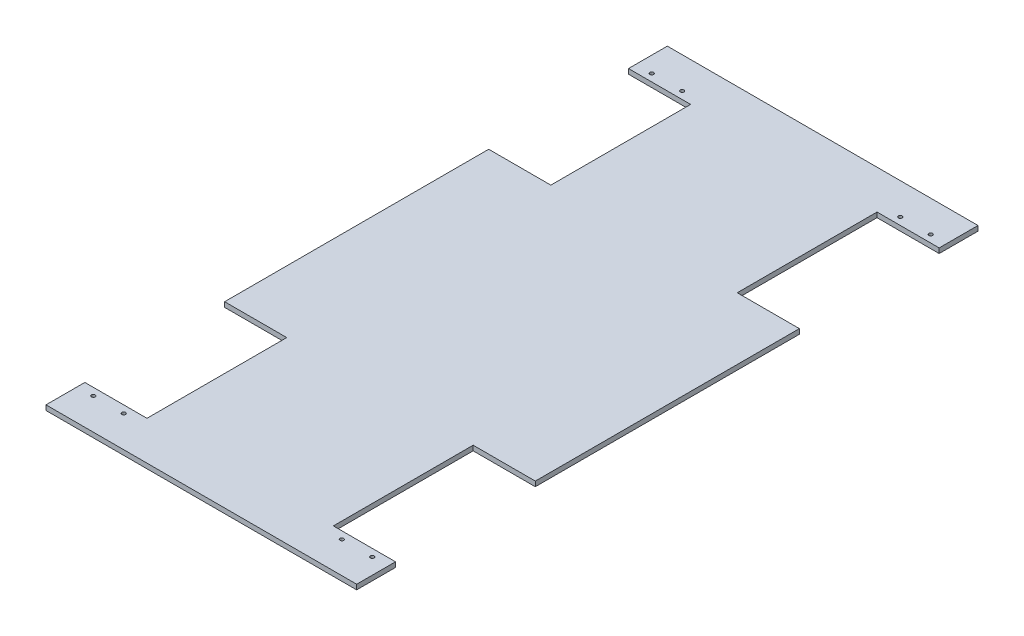
ISO-10303-21;
HEADER;
FILE_DESCRIPTION(('STEP AP214'),'2;1');
FILE_NAME('part.step','',(''),(''),'','','');
FILE_SCHEMA(('AUTOMOTIVE_DESIGN { 1 0 10303 214 1 1 1 1 }'));
ENDSEC;
DATA;
#1=APPLICATION_CONTEXT('core data for automotive mechanical design processes');
#2=APPLICATION_PROTOCOL_DEFINITION('international standard','automotive_design',2000,#1);
#3=PRODUCT_CONTEXT('',#1,'mechanical');
#4=PRODUCT('Part','Part','',(#3));
#5=PRODUCT_RELATED_PRODUCT_CATEGORY('part','',(#4));
#6=PRODUCT_DEFINITION_FORMATION('','',#4);
#7=PRODUCT_DEFINITION_CONTEXT('part definition',#1,'design');
#8=PRODUCT_DEFINITION('design','',#6,#7);
#9=PRODUCT_DEFINITION_SHAPE('','',#8);
#10=(LENGTH_UNIT() NAMED_UNIT(*) SI_UNIT(.MILLI.,.METRE.));
#11=(NAMED_UNIT(*) PLANE_ANGLE_UNIT() SI_UNIT($,.RADIAN.));
#12=(NAMED_UNIT(*) SI_UNIT($,.STERADIAN.) SOLID_ANGLE_UNIT());
#13=UNCERTAINTY_MEASURE_WITH_UNIT(LENGTH_MEASURE(1.E-05),#10,'distance_accuracy_value','');
#14=(GEOMETRIC_REPRESENTATION_CONTEXT(3) GLOBAL_UNCERTAINTY_ASSIGNED_CONTEXT((#13)) GLOBAL_UNIT_ASSIGNED_CONTEXT((#10,
#11,#12)) REPRESENTATION_CONTEXT('',''));
#15=CARTESIAN_POINT('',(0.,0.,0.));
#16=DIRECTION('',(0.,0.,1.));
#17=DIRECTION('',(1.,0.,0.));
#18=AXIS2_PLACEMENT_3D('',#15,#16,#17);
#19=CARTESIAN_POINT('',(-100.,3.175,-200.));
#20=DIRECTION('',(1.,0.,0.));
#21=DIRECTION('',(0.,0.,-1.));
#22=AXIS2_PLACEMENT_3D('',#19,#20,#21);
#23=PLANE('',#22);
#24=DIRECTION('',(0.,0.,1.));
#25=VECTOR('',#24,1.);
#26=CARTESIAN_POINT('',(-100.,0.,-200.));
#27=LINE('',#26,#25);
#28=CARTESIAN_POINT('',(-100.,0.,-200.));
#29=VERTEX_POINT('',#28);
#30=CARTESIAN_POINT('',(-100.,0.,-175.));
#31=VERTEX_POINT('',#30);
#32=EDGE_CURVE('E212',#29,#31,#27,.T.);
#33=ORIENTED_EDGE('',*,*,#32,.T.);
#34=DIRECTION('',(0.,-1.,0.));
#35=VECTOR('',#34,1.);
#36=CARTESIAN_POINT('',(-100.,3.175,-175.));
#37=LINE('',#36,#35);
#38=CARTESIAN_POINT('',(-100.,3.175,-175.));
#39=VERTEX_POINT('',#38);
#40=EDGE_CURVE('E11',#39,#31,#37,.T.);
#41=ORIENTED_EDGE('',*,*,#40,.F.);
#42=DIRECTION('',(0.,0.,1.));
#43=VECTOR('',#42,1.);
#44=CARTESIAN_POINT('',(-100.,3.175,-200.));
#45=LINE('',#44,#43);
#46=CARTESIAN_POINT('',(-100.,3.175,-200.));
#47=VERTEX_POINT('',#46);
#48=EDGE_CURVE('E271',#47,#39,#45,.T.);
#49=ORIENTED_EDGE('',*,*,#48,.F.);
#50=DIRECTION('',(0.,-1.,0.));
#51=VECTOR('',#50,1.);
#52=CARTESIAN_POINT('',(-100.,3.175,-200.));
#53=LINE('',#52,#51);
#54=EDGE_CURVE('E208',#47,#29,#53,.T.);
#55=ORIENTED_EDGE('',*,*,#54,.T.);
#56=EDGE_LOOP('',(#33,#41,#49,#55));
#57=FACE_BOUND('',#56,.T.);
#58=ADVANCED_FACE('F39',(#57),#23,.F.);
#59=CARTESIAN_POINT('',(-100.,3.175,-175.));
#60=DIRECTION('',(0.,0.,-1.));
#61=DIRECTION('',(-1.,0.,0.));
#62=AXIS2_PLACEMENT_3D('',#59,#60,#61);
#63=PLANE('',#62);
#64=DIRECTION('',(1.,0.,0.));
#65=VECTOR('',#64,1.);
#66=CARTESIAN_POINT('',(-100.,0.,-175.));
#67=LINE('',#66,#65);
#68=CARTESIAN_POINT('',(-60.,0.,-175.));
#69=VERTEX_POINT('',#68);
#70=EDGE_CURVE('E216',#31,#69,#67,.T.);
#71=ORIENTED_EDGE('',*,*,#70,.T.);
#72=DIRECTION('',(0.,-1.,0.));
#73=VECTOR('',#72,1.);
#74=CARTESIAN_POINT('',(-60.,3.175,-175.));
#75=LINE('',#74,#73);
#76=CARTESIAN_POINT('',(-60.,3.175,-175.));
#77=VERTEX_POINT('',#76);
#78=EDGE_CURVE('E48',#77,#69,#75,.T.);
#79=ORIENTED_EDGE('',*,*,#78,.F.);
#80=DIRECTION('',(1.,0.,0.));
#81=VECTOR('',#80,1.);
#82=CARTESIAN_POINT('',(-100.,3.175,-175.));
#83=LINE('',#82,#81);
#84=EDGE_CURVE('E135',#39,#77,#83,.T.);
#85=ORIENTED_EDGE('',*,*,#84,.F.);
#86=ORIENTED_EDGE('',*,*,#40,.T.);
#87=EDGE_LOOP('',(#71,#79,#85,#86));
#88=FACE_BOUND('',#87,.T.);
#89=ADVANCED_FACE('F422',(#88),#63,.F.);
#90=CARTESIAN_POINT('',(-60.,3.175,-175.));
#91=DIRECTION('',(1.,0.,0.));
#92=DIRECTION('',(0.,0.,-1.));
#93=AXIS2_PLACEMENT_3D('',#90,#91,#92);
#94=PLANE('',#93);
#95=DIRECTION('',(0.,0.,1.));
#96=VECTOR('',#95,1.);
#97=CARTESIAN_POINT('',(-60.,0.,-175.));
#98=LINE('',#97,#96);
#99=CARTESIAN_POINT('',(-60.,0.,-85.));
#100=VERTEX_POINT('',#99);
#101=EDGE_CURVE('E220',#69,#100,#98,.T.);
#102=ORIENTED_EDGE('',*,*,#101,.T.);
#103=DIRECTION('',(0.,-1.,0.));
#104=VECTOR('',#103,1.);
#105=CARTESIAN_POINT('',(-60.,3.175,-85.));
#106=LINE('',#105,#104);
#107=CARTESIAN_POINT('',(-60.,3.175,-85.));
#108=VERTEX_POINT('',#107);
#109=EDGE_CURVE('E330',#108,#100,#106,.T.);
#110=ORIENTED_EDGE('',*,*,#109,.F.);
#111=DIRECTION('',(0.,0.,1.));
#112=VECTOR('',#111,1.);
#113=CARTESIAN_POINT('',(-60.,3.175,-175.));
#114=LINE('',#113,#112);
#115=EDGE_CURVE('E340',#77,#108,#114,.T.);
#116=ORIENTED_EDGE('',*,*,#115,.F.);
#117=ORIENTED_EDGE('',*,*,#78,.T.);
#118=EDGE_LOOP('',(#102,#110,#116,#117));
#119=FACE_BOUND('',#118,.T.);
#120=ADVANCED_FACE('F338',(#119),#94,.F.);
#121=CARTESIAN_POINT('',(-100.,3.175,-85.));
#122=DIRECTION('',(0.,0.,1.));
#123=DIRECTION('',(1.,0.,0.));
#124=AXIS2_PLACEMENT_3D('',#121,#122,#123);
#125=PLANE('',#124);
#126=DIRECTION('',(-1.,0.,0.));
#127=VECTOR('',#126,1.);
#128=CARTESIAN_POINT('',(-100.,0.,-85.));
#129=LINE('',#128,#127);
#130=CARTESIAN_POINT('',(-100.,0.,-85.));
#131=VERTEX_POINT('',#130);
#132=EDGE_CURVE('E223',#100,#131,#129,.T.);
#133=ORIENTED_EDGE('',*,*,#132,.T.);
#134=DIRECTION('',(0.,-1.,0.));
#135=VECTOR('',#134,1.);
#136=CARTESIAN_POINT('',(-100.,3.175,-85.));
#137=LINE('',#136,#135);
#138=CARTESIAN_POINT('',(-100.,3.175,-85.));
#139=VERTEX_POINT('',#138);
#140=EDGE_CURVE('E326',#139,#131,#137,.T.);
#141=ORIENTED_EDGE('',*,*,#140,.F.);
#142=DIRECTION('',(-1.,0.,0.));
#143=VECTOR('',#142,1.);
#144=CARTESIAN_POINT('',(-100.,3.175,-85.));
#145=LINE('',#144,#143);
#146=EDGE_CURVE('E359',#108,#139,#145,.T.);
#147=ORIENTED_EDGE('',*,*,#146,.F.);
#148=ORIENTED_EDGE('',*,*,#109,.T.);
#149=EDGE_LOOP('',(#133,#141,#147,#148));
#150=FACE_BOUND('',#149,.T.);
#151=ADVANCED_FACE('F349',(#150),#125,.F.);
#152=CARTESIAN_POINT('',(-100.,3.175,-85.));
#153=DIRECTION('',(1.,0.,0.));
#154=DIRECTION('',(0.,0.,-1.));
#155=AXIS2_PLACEMENT_3D('',#152,#153,#154);
#156=PLANE('',#155);
#157=DIRECTION('',(0.,0.,1.));
#158=VECTOR('',#157,1.);
#159=CARTESIAN_POINT('',(-100.,0.,-85.));
#160=LINE('',#159,#158);
#161=CARTESIAN_POINT('',(-100.,0.,85.));
#162=VERTEX_POINT('',#161);
#163=EDGE_CURVE('E226',#131,#162,#160,.T.);
#164=ORIENTED_EDGE('',*,*,#163,.T.);
#165=DIRECTION('',(0.,-1.,0.));
#166=VECTOR('',#165,1.);
#167=CARTESIAN_POINT('',(-100.,3.175,85.));
#168=LINE('',#167,#166);
#169=CARTESIAN_POINT('',(-100.,3.175,85.));
#170=VERTEX_POINT('',#169);
#171=EDGE_CURVE('E322',#170,#162,#168,.T.);
#172=ORIENTED_EDGE('',*,*,#171,.F.);
#173=DIRECTION('',(0.,0.,1.));
#174=VECTOR('',#173,1.);
#175=CARTESIAN_POINT('',(-100.,3.175,-85.));
#176=LINE('',#175,#174);
#177=EDGE_CURVE('E355',#139,#170,#176,.T.);
#178=ORIENTED_EDGE('',*,*,#177,.F.);
#179=ORIENTED_EDGE('',*,*,#140,.T.);
#180=EDGE_LOOP('',(#164,#172,#178,#179));
#181=FACE_BOUND('',#180,.T.);
#182=ADVANCED_FACE('F353',(#181),#156,.F.);
#183=CARTESIAN_POINT('',(-100.,3.175,85.));
#184=DIRECTION('',(0.,0.,-1.));
#185=DIRECTION('',(-1.,0.,0.));
#186=AXIS2_PLACEMENT_3D('',#183,#184,#185);
#187=PLANE('',#186);
#188=DIRECTION('',(1.,0.,0.));
#189=VECTOR('',#188,1.);
#190=CARTESIAN_POINT('',(-100.,0.,85.));
#191=LINE('',#190,#189);
#192=CARTESIAN_POINT('',(-60.,0.,85.));
#193=VERTEX_POINT('',#192);
#194=EDGE_CURVE('E229',#162,#193,#191,.T.);
#195=ORIENTED_EDGE('',*,*,#194,.T.);
#196=DIRECTION('',(0.,-1.,0.));
#197=VECTOR('',#196,1.);
#198=CARTESIAN_POINT('',(-60.,3.175,85.));
#199=LINE('',#198,#197);
#200=CARTESIAN_POINT('',(-60.,3.175,85.));
#201=VERTEX_POINT('',#200);
#202=EDGE_CURVE('E318',#201,#193,#199,.T.);
#203=ORIENTED_EDGE('',*,*,#202,.F.);
#204=DIRECTION('',(1.,0.,0.));
#205=VECTOR('',#204,1.);
#206=CARTESIAN_POINT('',(-100.,3.175,85.));
#207=LINE('',#206,#205);
#208=EDGE_CURVE('E358',#170,#201,#207,.T.);
#209=ORIENTED_EDGE('',*,*,#208,.F.);
#210=ORIENTED_EDGE('',*,*,#171,.T.);
#211=EDGE_LOOP('',(#195,#203,#209,#210));
#212=FACE_BOUND('',#211,.T.);
#213=ADVANCED_FACE('F435',(#212),#187,.F.);
#214=CARTESIAN_POINT('',(-60.,3.175,85.));
#215=DIRECTION('',(1.,0.,0.));
#216=DIRECTION('',(0.,0.,-1.));
#217=AXIS2_PLACEMENT_3D('',#214,#215,#216);
#218=PLANE('',#217);
#219=DIRECTION('',(0.,0.,1.));
#220=VECTOR('',#219,1.);
#221=CARTESIAN_POINT('',(-60.,0.,85.));
#222=LINE('',#221,#220);
#223=CARTESIAN_POINT('',(-60.,0.,175.));
#224=VERTEX_POINT('',#223);
#225=EDGE_CURVE('E232',#193,#224,#222,.T.);
#226=ORIENTED_EDGE('',*,*,#225,.T.);
#227=DIRECTION('',(0.,-1.,0.));
#228=VECTOR('',#227,1.);
#229=CARTESIAN_POINT('',(-60.,3.175,175.));
#230=LINE('',#229,#228);
#231=CARTESIAN_POINT('',(-60.,3.175,175.));
#232=VERTEX_POINT('',#231);
#233=EDGE_CURVE('E314',#232,#224,#230,.T.);
#234=ORIENTED_EDGE('',*,*,#233,.F.);
#235=DIRECTION('',(0.,0.,1.));
#236=VECTOR('',#235,1.);
#237=CARTESIAN_POINT('',(-60.,3.175,85.));
#238=LINE('',#237,#236);
#239=EDGE_CURVE('E363',#201,#232,#238,.T.);
#240=ORIENTED_EDGE('',*,*,#239,.F.);
#241=ORIENTED_EDGE('',*,*,#202,.T.);
#242=EDGE_LOOP('',(#226,#234,#240,#241));
#243=FACE_BOUND('',#242,.T.);
#244=ADVANCED_FACE('F438',(#243),#218,.F.);
#245=CARTESIAN_POINT('',(-100.,3.175,175.));
#246=DIRECTION('',(0.,0.,1.));
#247=DIRECTION('',(1.,0.,0.));
#248=AXIS2_PLACEMENT_3D('',#245,#246,#247);
#249=PLANE('',#248);
#250=DIRECTION('',(-1.,0.,0.));
#251=VECTOR('',#250,1.);
#252=CARTESIAN_POINT('',(-100.,0.,175.));
#253=LINE('',#252,#251);
#254=CARTESIAN_POINT('',(-100.,0.,175.));
#255=VERTEX_POINT('',#254);
#256=EDGE_CURVE('E235',#224,#255,#253,.T.);
#257=ORIENTED_EDGE('',*,*,#256,.T.);
#258=DIRECTION('',(0.,-1.,0.));
#259=VECTOR('',#258,1.);
#260=CARTESIAN_POINT('',(-100.,3.175,175.));
#261=LINE('',#260,#259);
#262=CARTESIAN_POINT('',(-100.,3.175,175.));
#263=VERTEX_POINT('',#262);
#264=EDGE_CURVE('E310',#263,#255,#261,.T.);
#265=ORIENTED_EDGE('',*,*,#264,.F.);
#266=DIRECTION('',(-1.,0.,0.));
#267=VECTOR('',#266,1.);
#268=CARTESIAN_POINT('',(-100.,3.175,175.));
#269=LINE('',#268,#267);
#270=EDGE_CURVE('E370',#232,#263,#269,.T.);
#271=ORIENTED_EDGE('',*,*,#270,.F.);
#272=ORIENTED_EDGE('',*,*,#233,.T.);
#273=EDGE_LOOP('',(#257,#265,#271,#272));
#274=FACE_BOUND('',#273,.T.);
#275=ADVANCED_FACE('F442',(#274),#249,.F.);
#276=CARTESIAN_POINT('',(-100.,3.175,175.));
#277=DIRECTION('',(1.,0.,0.));
#278=DIRECTION('',(0.,0.,-1.));
#279=AXIS2_PLACEMENT_3D('',#276,#277,#278);
#280=PLANE('',#279);
#281=DIRECTION('',(0.,0.,1.));
#282=VECTOR('',#281,1.);
#283=CARTESIAN_POINT('',(-100.,0.,175.));
#284=LINE('',#283,#282);
#285=CARTESIAN_POINT('',(-100.,0.,200.));
#286=VERTEX_POINT('',#285);
#287=EDGE_CURVE('E238',#255,#286,#284,.T.);
#288=ORIENTED_EDGE('',*,*,#287,.T.);
#289=DIRECTION('',(0.,-1.,0.));
#290=VECTOR('',#289,1.);
#291=CARTESIAN_POINT('',(-100.,3.175,200.));
#292=LINE('',#291,#290);
#293=CARTESIAN_POINT('',(-100.,3.175,200.));
#294=VERTEX_POINT('',#293);
#295=EDGE_CURVE('E306',#294,#286,#292,.T.);
#296=ORIENTED_EDGE('',*,*,#295,.F.);
#297=DIRECTION('',(0.,0.,1.));
#298=VECTOR('',#297,1.);
#299=CARTESIAN_POINT('',(-100.,3.175,175.));
#300=LINE('',#299,#298);
#301=EDGE_CURVE('E373',#263,#294,#300,.T.);
#302=ORIENTED_EDGE('',*,*,#301,.F.);
#303=ORIENTED_EDGE('',*,*,#264,.T.);
#304=EDGE_LOOP('',(#288,#296,#302,#303));
#305=FACE_BOUND('',#304,.T.);
#306=ADVANCED_FACE('F446',(#305),#280,.F.);
#307=CARTESIAN_POINT('',(-100.,3.175,200.));
#308=DIRECTION('',(0.,0.,-1.));
#309=DIRECTION('',(-1.,0.,0.));
#310=AXIS2_PLACEMENT_3D('',#307,#308,#309);
#311=PLANE('',#310);
#312=DIRECTION('',(1.,0.,0.));
#313=VECTOR('',#312,1.);
#314=CARTESIAN_POINT('',(-100.,0.,200.));
#315=LINE('',#314,#313);
#316=CARTESIAN_POINT('',(100.,0.,200.));
#317=VERTEX_POINT('',#316);
#318=EDGE_CURVE('E241',#286,#317,#315,.T.);
#319=ORIENTED_EDGE('',*,*,#318,.T.);
#320=DIRECTION('',(0.,-1.,0.));
#321=VECTOR('',#320,1.);
#322=CARTESIAN_POINT('',(100.,3.175,200.));
#323=LINE('',#322,#321);
#324=CARTESIAN_POINT('',(100.,3.175,200.));
#325=VERTEX_POINT('',#324);
#326=EDGE_CURVE('E302',#325,#317,#323,.T.);
#327=ORIENTED_EDGE('',*,*,#326,.F.);
#328=DIRECTION('',(1.,0.,0.));
#329=VECTOR('',#328,1.);
#330=CARTESIAN_POINT('',(-100.,3.175,200.));
#331=LINE('',#330,#329);
#332=EDGE_CURVE('E376',#294,#325,#331,.T.);
#333=ORIENTED_EDGE('',*,*,#332,.F.);
#334=ORIENTED_EDGE('',*,*,#295,.T.);
#335=EDGE_LOOP('',(#319,#327,#333,#334));
#336=FACE_BOUND('',#335,.T.);
#337=ADVANCED_FACE('F450',(#336),#311,.F.);
#338=CARTESIAN_POINT('',(100.,3.175,175.));
#339=DIRECTION('',(-1.,0.,0.));
#340=DIRECTION('',(0.,0.,1.));
#341=AXIS2_PLACEMENT_3D('',#338,#339,#340);
#342=PLANE('',#341);
#343=DIRECTION('',(0.,0.,-1.));
#344=VECTOR('',#343,1.);
#345=CARTESIAN_POINT('',(100.,0.,175.));
#346=LINE('',#345,#344);
#347=CARTESIAN_POINT('',(100.,0.,175.));
#348=VERTEX_POINT('',#347);
#349=EDGE_CURVE('E244',#317,#348,#346,.T.);
#350=ORIENTED_EDGE('',*,*,#349,.T.);
#351=DIRECTION('',(0.,-1.,0.));
#352=VECTOR('',#351,1.);
#353=CARTESIAN_POINT('',(100.,3.175,175.));
#354=LINE('',#353,#352);
#355=CARTESIAN_POINT('',(100.,3.175,175.));
#356=VERTEX_POINT('',#355);
#357=EDGE_CURVE('E298',#356,#348,#354,.T.);
#358=ORIENTED_EDGE('',*,*,#357,.F.);
#359=DIRECTION('',(0.,0.,-1.));
#360=VECTOR('',#359,1.);
#361=CARTESIAN_POINT('',(100.,3.175,175.));
#362=LINE('',#361,#360);
#363=EDGE_CURVE('E379',#325,#356,#362,.T.);
#364=ORIENTED_EDGE('',*,*,#363,.F.);
#365=ORIENTED_EDGE('',*,*,#326,.T.);
#366=EDGE_LOOP('',(#350,#358,#364,#365));
#367=FACE_BOUND('',#366,.T.);
#368=ADVANCED_FACE('F454',(#367),#342,.F.);
#369=CARTESIAN_POINT('',(100.,3.175,175.));
#370=DIRECTION('',(0.,0.,1.));
#371=DIRECTION('',(1.,0.,0.));
#372=AXIS2_PLACEMENT_3D('',#369,#370,#371);
#373=PLANE('',#372);
#374=DIRECTION('',(-1.,0.,0.));
#375=VECTOR('',#374,1.);
#376=CARTESIAN_POINT('',(100.,0.,175.));
#377=LINE('',#376,#375);
#378=CARTESIAN_POINT('',(60.,0.,175.));
#379=VERTEX_POINT('',#378);
#380=EDGE_CURVE('E247',#348,#379,#377,.T.);
#381=ORIENTED_EDGE('',*,*,#380,.T.);
#382=DIRECTION('',(0.,-1.,0.));
#383=VECTOR('',#382,1.);
#384=CARTESIAN_POINT('',(60.,3.175,175.));
#385=LINE('',#384,#383);
#386=CARTESIAN_POINT('',(60.,3.175,175.));
#387=VERTEX_POINT('',#386);
#388=EDGE_CURVE('E294',#387,#379,#385,.T.);
#389=ORIENTED_EDGE('',*,*,#388,.F.);
#390=DIRECTION('',(-1.,0.,0.));
#391=VECTOR('',#390,1.);
#392=CARTESIAN_POINT('',(100.,3.175,175.));
#393=LINE('',#392,#391);
#394=EDGE_CURVE('E382',#356,#387,#393,.T.);
#395=ORIENTED_EDGE('',*,*,#394,.F.);
#396=ORIENTED_EDGE('',*,*,#357,.T.);
#397=EDGE_LOOP('',(#381,#389,#395,#396));
#398=FACE_BOUND('',#397,.T.);
#399=ADVANCED_FACE('F458',(#398),#373,.F.);
#400=CARTESIAN_POINT('',(60.,3.175,85.));
#401=DIRECTION('',(-1.,0.,0.));
#402=DIRECTION('',(0.,0.,1.));
#403=AXIS2_PLACEMENT_3D('',#400,#401,#402);
#404=PLANE('',#403);
#405=DIRECTION('',(0.,0.,-1.));
#406=VECTOR('',#405,1.);
#407=CARTESIAN_POINT('',(60.,0.,85.));
#408=LINE('',#407,#406);
#409=CARTESIAN_POINT('',(60.,0.,85.));
#410=VERTEX_POINT('',#409);
#411=EDGE_CURVE('E250',#379,#410,#408,.T.);
#412=ORIENTED_EDGE('',*,*,#411,.T.);
#413=DIRECTION('',(0.,-1.,0.));
#414=VECTOR('',#413,1.);
#415=CARTESIAN_POINT('',(60.,3.175,85.));
#416=LINE('',#415,#414);
#417=CARTESIAN_POINT('',(60.,3.175,85.));
#418=VERTEX_POINT('',#417);
#419=EDGE_CURVE('E290',#418,#410,#416,.T.);
#420=ORIENTED_EDGE('',*,*,#419,.F.);
#421=DIRECTION('',(0.,0.,-1.));
#422=VECTOR('',#421,1.);
#423=CARTESIAN_POINT('',(60.,3.175,85.));
#424=LINE('',#423,#422);
#425=EDGE_CURVE('E385',#387,#418,#424,.T.);
#426=ORIENTED_EDGE('',*,*,#425,.F.);
#427=ORIENTED_EDGE('',*,*,#388,.T.);
#428=EDGE_LOOP('',(#412,#420,#426,#427));
#429=FACE_BOUND('',#428,.T.);
#430=ADVANCED_FACE('F462',(#429),#404,.F.);
#431=CARTESIAN_POINT('',(100.,3.175,85.));
#432=DIRECTION('',(0.,0.,-1.));
#433=DIRECTION('',(-1.,0.,0.));
#434=AXIS2_PLACEMENT_3D('',#431,#432,#433);
#435=PLANE('',#434);
#436=DIRECTION('',(1.,0.,0.));
#437=VECTOR('',#436,1.);
#438=CARTESIAN_POINT('',(100.,0.,85.));
#439=LINE('',#438,#437);
#440=CARTESIAN_POINT('',(100.,0.,85.));
#441=VERTEX_POINT('',#440);
#442=EDGE_CURVE('E253',#410,#441,#439,.T.);
#443=ORIENTED_EDGE('',*,*,#442,.T.);
#444=DIRECTION('',(0.,-1.,0.));
#445=VECTOR('',#444,1.);
#446=CARTESIAN_POINT('',(100.,3.175,85.));
#447=LINE('',#446,#445);
#448=CARTESIAN_POINT('',(100.,3.175,85.));
#449=VERTEX_POINT('',#448);
#450=EDGE_CURVE('E286',#449,#441,#447,.T.);
#451=ORIENTED_EDGE('',*,*,#450,.F.);
#452=DIRECTION('',(1.,0.,0.));
#453=VECTOR('',#452,1.);
#454=CARTESIAN_POINT('',(100.,3.175,85.));
#455=LINE('',#454,#453);
#456=EDGE_CURVE('E388',#418,#449,#455,.T.);
#457=ORIENTED_EDGE('',*,*,#456,.F.);
#458=ORIENTED_EDGE('',*,*,#419,.T.);
#459=EDGE_LOOP('',(#443,#451,#457,#458));
#460=FACE_BOUND('',#459,.T.);
#461=ADVANCED_FACE('F466',(#460),#435,.F.);
#462=CARTESIAN_POINT('',(100.,3.175,-85.));
#463=DIRECTION('',(-1.,0.,0.));
#464=DIRECTION('',(0.,0.,1.));
#465=AXIS2_PLACEMENT_3D('',#462,#463,#464);
#466=PLANE('',#465);
#467=DIRECTION('',(0.,0.,-1.));
#468=VECTOR('',#467,1.);
#469=CARTESIAN_POINT('',(100.,0.,-85.));
#470=LINE('',#469,#468);
#471=CARTESIAN_POINT('',(100.,0.,-85.));
#472=VERTEX_POINT('',#471);
#473=EDGE_CURVE('E256',#441,#472,#470,.T.);
#474=ORIENTED_EDGE('',*,*,#473,.T.);
#475=DIRECTION('',(0.,-1.,0.));
#476=VECTOR('',#475,1.);
#477=CARTESIAN_POINT('',(100.,3.175,-85.));
#478=LINE('',#477,#476);
#479=CARTESIAN_POINT('',(100.,3.175,-85.));
#480=VERTEX_POINT('',#479);
#481=EDGE_CURVE('E282',#480,#472,#478,.T.);
#482=ORIENTED_EDGE('',*,*,#481,.F.);
#483=DIRECTION('',(0.,0.,-1.));
#484=VECTOR('',#483,1.);
#485=CARTESIAN_POINT('',(100.,3.175,-85.));
#486=LINE('',#485,#484);
#487=EDGE_CURVE('E391',#449,#480,#486,.T.);
#488=ORIENTED_EDGE('',*,*,#487,.F.);
#489=ORIENTED_EDGE('',*,*,#450,.T.);
#490=EDGE_LOOP('',(#474,#482,#488,#489));
#491=FACE_BOUND('',#490,.T.);
#492=ADVANCED_FACE('F470',(#491),#466,.F.);
#493=CARTESIAN_POINT('',(100.,3.175,-85.));
#494=DIRECTION('',(0.,0.,1.));
#495=DIRECTION('',(1.,0.,0.));
#496=AXIS2_PLACEMENT_3D('',#493,#494,#495);
#497=PLANE('',#496);
#498=DIRECTION('',(-1.,0.,0.));
#499=VECTOR('',#498,1.);
#500=CARTESIAN_POINT('',(100.,0.,-85.));
#501=LINE('',#500,#499);
#502=CARTESIAN_POINT('',(60.,0.,-85.));
#503=VERTEX_POINT('',#502);
#504=EDGE_CURVE('E259',#472,#503,#501,.T.);
#505=ORIENTED_EDGE('',*,*,#504,.T.);
#506=DIRECTION('',(0.,-1.,0.));
#507=VECTOR('',#506,1.);
#508=CARTESIAN_POINT('',(60.,3.175,-85.));
#509=LINE('',#508,#507);
#510=CARTESIAN_POINT('',(60.,3.175,-85.));
#511=VERTEX_POINT('',#510);
#512=EDGE_CURVE('E278',#511,#503,#509,.T.);
#513=ORIENTED_EDGE('',*,*,#512,.F.);
#514=DIRECTION('',(-1.,0.,0.));
#515=VECTOR('',#514,1.);
#516=CARTESIAN_POINT('',(100.,3.175,-85.));
#517=LINE('',#516,#515);
#518=EDGE_CURVE('E394',#480,#511,#517,.T.);
#519=ORIENTED_EDGE('',*,*,#518,.F.);
#520=ORIENTED_EDGE('',*,*,#481,.T.);
#521=EDGE_LOOP('',(#505,#513,#519,#520));
#522=FACE_BOUND('',#521,.T.);
#523=ADVANCED_FACE('F402',(#522),#497,.F.);
#524=CARTESIAN_POINT('',(60.,3.175,-175.));
#525=DIRECTION('',(-1.,0.,0.));
#526=DIRECTION('',(0.,0.,1.));
#527=AXIS2_PLACEMENT_3D('',#524,#525,#526);
#528=PLANE('',#527);
#529=DIRECTION('',(0.,0.,-1.));
#530=VECTOR('',#529,1.);
#531=CARTESIAN_POINT('',(60.,0.,-175.));
#532=LINE('',#531,#530);
#533=CARTESIAN_POINT('',(60.,0.,-175.));
#534=VERTEX_POINT('',#533);
#535=EDGE_CURVE('E262',#503,#534,#532,.T.);
#536=ORIENTED_EDGE('',*,*,#535,.T.);
#537=DIRECTION('',(0.,-1.,0.));
#538=VECTOR('',#537,1.);
#539=CARTESIAN_POINT('',(60.,3.175,-175.));
#540=LINE('',#539,#538);
#541=CARTESIAN_POINT('',(60.,3.175,-175.));
#542=VERTEX_POINT('',#541);
#543=EDGE_CURVE('E201',#542,#534,#540,.T.);
#544=ORIENTED_EDGE('',*,*,#543,.F.);
#545=DIRECTION('',(0.,0.,-1.));
#546=VECTOR('',#545,1.);
#547=CARTESIAN_POINT('',(60.,3.175,-175.));
#548=LINE('',#547,#546);
#549=EDGE_CURVE('E190',#511,#542,#548,.T.);
#550=ORIENTED_EDGE('',*,*,#549,.F.);
#551=ORIENTED_EDGE('',*,*,#512,.T.);
#552=EDGE_LOOP('',(#536,#544,#550,#551));
#553=FACE_BOUND('',#552,.T.);
#554=ADVANCED_FACE('F406',(#553),#528,.F.);
#555=CARTESIAN_POINT('',(100.,3.175,-175.));
#556=DIRECTION('',(0.,0.,-1.));
#557=DIRECTION('',(-1.,0.,0.));
#558=AXIS2_PLACEMENT_3D('',#555,#556,#557);
#559=PLANE('',#558);
#560=DIRECTION('',(1.,0.,0.));
#561=VECTOR('',#560,1.);
#562=CARTESIAN_POINT('',(100.,0.,-175.));
#563=LINE('',#562,#561);
#564=CARTESIAN_POINT('',(100.,0.,-175.));
#565=VERTEX_POINT('',#564);
#566=EDGE_CURVE('E199',#534,#565,#563,.T.);
#567=ORIENTED_EDGE('',*,*,#566,.T.);
#568=DIRECTION('',(0.,-1.,0.));
#569=VECTOR('',#568,1.);
#570=CARTESIAN_POINT('',(100.,3.175,-175.));
#571=LINE('',#570,#569);
#572=CARTESIAN_POINT('',(100.,3.175,-175.));
#573=VERTEX_POINT('',#572);
#574=EDGE_CURVE('E196',#573,#565,#571,.T.);
#575=ORIENTED_EDGE('',*,*,#574,.F.);
#576=DIRECTION('',(1.,0.,0.));
#577=VECTOR('',#576,1.);
#578=CARTESIAN_POINT('',(100.,3.175,-175.));
#579=LINE('',#578,#577);
#580=EDGE_CURVE('E184',#542,#573,#579,.T.);
#581=ORIENTED_EDGE('',*,*,#580,.F.);
#582=ORIENTED_EDGE('',*,*,#543,.T.);
#583=EDGE_LOOP('',(#567,#575,#581,#582));
#584=FACE_BOUND('',#583,.T.);
#585=ADVANCED_FACE('F197',(#584),#559,.F.);
#586=CARTESIAN_POINT('',(100.,3.175,-200.));
#587=DIRECTION('',(-1.,0.,0.));
#588=DIRECTION('',(0.,0.,1.));
#589=AXIS2_PLACEMENT_3D('',#586,#587,#588);
#590=PLANE('',#589);
#591=DIRECTION('',(0.,0.,-1.));
#592=VECTOR('',#591,1.);
#593=CARTESIAN_POINT('',(100.,0.,-200.));
#594=LINE('',#593,#592);
#595=CARTESIAN_POINT('',(100.,0.,-200.));
#596=VERTEX_POINT('',#595);
#597=EDGE_CURVE('E121',#565,#596,#594,.T.);
#598=ORIENTED_EDGE('',*,*,#597,.T.);
#599=DIRECTION('',(0.,-1.,0.));
#600=VECTOR('',#599,1.);
#601=CARTESIAN_POINT('',(100.,3.175,-200.));
#602=LINE('',#601,#600);
#603=CARTESIAN_POINT('',(100.,3.175,-200.));
#604=VERTEX_POINT('',#603);
#605=EDGE_CURVE('E202',#604,#596,#602,.T.);
#606=ORIENTED_EDGE('',*,*,#605,.F.);
#607=DIRECTION('',(0.,0.,-1.));
#608=VECTOR('',#607,1.);
#609=CARTESIAN_POINT('',(100.,3.175,-200.));
#610=LINE('',#609,#608);
#611=EDGE_CURVE('E188',#573,#604,#610,.T.);
#612=ORIENTED_EDGE('',*,*,#611,.F.);
#613=ORIENTED_EDGE('',*,*,#574,.T.);
#614=EDGE_LOOP('',(#598,#606,#612,#613));
#615=FACE_BOUND('',#614,.T.);
#616=ADVANCED_FACE('F204',(#615),#590,.F.);
#617=CARTESIAN_POINT('',(-100.,3.175,-200.));
#618=DIRECTION('',(0.,0.,1.));
#619=DIRECTION('',(1.,0.,0.));
#620=AXIS2_PLACEMENT_3D('',#617,#618,#619);
#621=PLANE('',#620);
#622=DIRECTION('',(-1.,0.,0.));
#623=VECTOR('',#622,1.);
#624=CARTESIAN_POINT('',(-100.,0.,-200.));
#625=LINE('',#624,#623);
#626=EDGE_CURVE('E127',#596,#29,#625,.T.);
#627=ORIENTED_EDGE('',*,*,#626,.T.);
#628=ORIENTED_EDGE('',*,*,#54,.F.);
#629=DIRECTION('',(-1.,0.,0.));
#630=VECTOR('',#629,1.);
#631=CARTESIAN_POINT('',(-100.,3.175,-200.));
#632=LINE('',#631,#630);
#633=EDGE_CURVE('E56',#604,#47,#632,.T.);
#634=ORIENTED_EDGE('',*,*,#633,.F.);
#635=ORIENTED_EDGE('',*,*,#605,.T.);
#636=EDGE_LOOP('',(#627,#628,#634,#635));
#637=FACE_BOUND('',#636,.T.);
#638=ADVANCED_FACE('F410',(#637),#621,.F.);
#639=CARTESIAN_POINT('',(0.,3.175,0.));
#640=DIRECTION('',(0.,1.,0.));
#641=DIRECTION('',(0.,0.,1.));
#642=AXIS2_PLACEMENT_3D('',#639,#640,#641);
#643=PLANE('',#642);
#644=CARTESIAN_POINT('',(89.78,3.175,179.7625));
#645=DIRECTION('',(0.,1.,0.));
#646=DIRECTION('',(0.,0.,1.));
#647=AXIS2_PLACEMENT_3D('',#644,#645,#646);
#648=CIRCLE('',#647,1.190625);
#649=CARTESIAN_POINT('',(89.78,3.175,180.953125));
#650=VERTEX_POINT('',#649);
#651=EDGE_CURVE('E596',#650,#650,#648,.T.);
#652=ORIENTED_EDGE('',*,*,#651,.F.);
#653=EDGE_LOOP('',(#652));
#654=FACE_BOUND('',#653,.T.);
#655=CARTESIAN_POINT('',(70.22,3.175,179.7625));
#656=DIRECTION('',(0.,1.,0.));
#657=DIRECTION('',(0.,0.,1.));
#658=AXIS2_PLACEMENT_3D('',#655,#656,#657);
#659=CIRCLE('',#658,1.190625);
#660=CARTESIAN_POINT('',(70.22,3.175,180.953125));
#661=VERTEX_POINT('',#660);
#662=EDGE_CURVE('E600',#661,#661,#659,.T.);
#663=ORIENTED_EDGE('',*,*,#662,.F.);
#664=EDGE_LOOP('',(#663));
#665=FACE_BOUND('',#664,.T.);
#666=CARTESIAN_POINT('',(89.78,3.175,-179.7625));
#667=DIRECTION('',(0.,1.,0.));
#668=DIRECTION('',(0.,0.,1.));
#669=AXIS2_PLACEMENT_3D('',#666,#667,#668);
#670=CIRCLE('',#669,1.190625);
#671=CARTESIAN_POINT('',(89.78,3.175,-178.571875));
#672=VERTEX_POINT('',#671);
#673=EDGE_CURVE('E610',#672,#672,#670,.T.);
#674=ORIENTED_EDGE('',*,*,#673,.F.);
#675=EDGE_LOOP('',(#674));
#676=FACE_BOUND('',#675,.T.);
#677=CARTESIAN_POINT('',(70.22,3.175,-179.7625));
#678=DIRECTION('',(0.,1.,0.));
#679=DIRECTION('',(0.,0.,1.));
#680=AXIS2_PLACEMENT_3D('',#677,#678,#679);
#681=CIRCLE('',#680,1.190625);
#682=CARTESIAN_POINT('',(70.22,3.175,-178.571875));
#683=VERTEX_POINT('',#682);
#684=EDGE_CURVE('E618',#683,#683,#681,.T.);
#685=ORIENTED_EDGE('',*,*,#684,.F.);
#686=EDGE_LOOP('',(#685));
#687=FACE_BOUND('',#686,.T.);
#688=CARTESIAN_POINT('',(-89.78,3.175,179.7625));
#689=DIRECTION('',(0.,1.,0.));
#690=DIRECTION('',(0.,0.,1.));
#691=AXIS2_PLACEMENT_3D('',#688,#689,#690);
#692=CIRCLE('',#691,1.190625);
#693=CARTESIAN_POINT('',(-89.78,3.175,180.953125));
#694=VERTEX_POINT('',#693);
#695=EDGE_CURVE('E626',#694,#694,#692,.T.);
#696=ORIENTED_EDGE('',*,*,#695,.F.);
#697=EDGE_LOOP('',(#696));
#698=FACE_BOUND('',#697,.T.);
#699=CARTESIAN_POINT('',(-70.22,3.175,179.7625));
#700=DIRECTION('',(0.,1.,0.));
#701=DIRECTION('',(0.,0.,1.));
#702=AXIS2_PLACEMENT_3D('',#699,#700,#701);
#703=CIRCLE('',#702,1.190625);
#704=CARTESIAN_POINT('',(-70.22,3.175,180.953125));
#705=VERTEX_POINT('',#704);
#706=EDGE_CURVE('E634',#705,#705,#703,.T.);
#707=ORIENTED_EDGE('',*,*,#706,.F.);
#708=EDGE_LOOP('',(#707));
#709=FACE_BOUND('',#708,.T.);
#710=CARTESIAN_POINT('',(-89.78,3.175,-179.7625));
#711=DIRECTION('',(0.,1.,0.));
#712=DIRECTION('',(0.,0.,1.));
#713=AXIS2_PLACEMENT_3D('',#710,#711,#712);
#714=CIRCLE('',#713,1.190625);
#715=CARTESIAN_POINT('',(-89.78,3.175,-178.571875));
#716=VERTEX_POINT('',#715);
#717=EDGE_CURVE('E642',#716,#716,#714,.T.);
#718=ORIENTED_EDGE('',*,*,#717,.F.);
#719=EDGE_LOOP('',(#718));
#720=FACE_BOUND('',#719,.T.);
#721=CARTESIAN_POINT('',(-70.22,3.175,-179.7625));
#722=DIRECTION('',(0.,1.,0.));
#723=DIRECTION('',(0.,0.,1.));
#724=AXIS2_PLACEMENT_3D('',#721,#722,#723);
#725=CIRCLE('',#724,1.190625);
#726=CARTESIAN_POINT('',(-70.22,3.175,-178.571875));
#727=VERTEX_POINT('',#726);
#728=EDGE_CURVE('E650',#727,#727,#725,.T.);
#729=ORIENTED_EDGE('',*,*,#728,.F.);
#730=EDGE_LOOP('',(#729));
#731=FACE_BOUND('',#730,.T.);
#732=ORIENTED_EDGE('',*,*,#48,.T.);
#733=ORIENTED_EDGE('',*,*,#84,.T.);
#734=ORIENTED_EDGE('',*,*,#115,.T.);
#735=ORIENTED_EDGE('',*,*,#146,.T.);
#736=ORIENTED_EDGE('',*,*,#177,.T.);
#737=ORIENTED_EDGE('',*,*,#208,.T.);
#738=ORIENTED_EDGE('',*,*,#239,.T.);
#739=ORIENTED_EDGE('',*,*,#270,.T.);
#740=ORIENTED_EDGE('',*,*,#301,.T.);
#741=ORIENTED_EDGE('',*,*,#332,.T.);
#742=ORIENTED_EDGE('',*,*,#363,.T.);
#743=ORIENTED_EDGE('',*,*,#394,.T.);
#744=ORIENTED_EDGE('',*,*,#425,.T.);
#745=ORIENTED_EDGE('',*,*,#456,.T.);
#746=ORIENTED_EDGE('',*,*,#487,.T.);
#747=ORIENTED_EDGE('',*,*,#518,.T.);
#748=ORIENTED_EDGE('',*,*,#549,.T.);
#749=ORIENTED_EDGE('',*,*,#580,.T.);
#750=ORIENTED_EDGE('',*,*,#611,.T.);
#751=ORIENTED_EDGE('',*,*,#633,.T.);
#752=EDGE_LOOP('',(#732,#733,#734,#735,#736,#737,#738,#739,#740,#741,#742,#743,#744,#745,#746,
#747,#748,#749,#750,#751));
#753=FACE_BOUND('',#752,.T.);
#754=ADVANCED_FACE('F186',(#654,#665,#676,#687,#698,#709,#720,#731,#753),#643,.T.);
#755=CARTESIAN_POINT('',(0.,0.,0.));
#756=DIRECTION('',(0.,1.,0.));
#757=DIRECTION('',(0.,0.,1.));
#758=AXIS2_PLACEMENT_3D('',#755,#756,#757);
#759=PLANE('',#758);
#760=CARTESIAN_POINT('',(89.78,0.,179.7625));
#761=DIRECTION('',(0.,1.,0.));
#762=DIRECTION('',(0.,0.,1.));
#763=AXIS2_PLACEMENT_3D('',#760,#761,#762);
#764=CIRCLE('',#763,1.190625);
#765=CARTESIAN_POINT('',(89.78,0.,180.953125));
#766=VERTEX_POINT('',#765);
#767=EDGE_CURVE('E593',#766,#766,#764,.T.);
#768=ORIENTED_EDGE('',*,*,#767,.T.);
#769=EDGE_LOOP('',(#768));
#770=FACE_BOUND('',#769,.T.);
#771=CARTESIAN_POINT('',(70.22,0.,179.7625));
#772=DIRECTION('',(0.,1.,0.));
#773=DIRECTION('',(0.,0.,1.));
#774=AXIS2_PLACEMENT_3D('',#771,#772,#773);
#775=CIRCLE('',#774,1.190625);
#776=CARTESIAN_POINT('',(70.22,0.,180.953125));
#777=VERTEX_POINT('',#776);
#778=EDGE_CURVE('E606',#777,#777,#775,.T.);
#779=ORIENTED_EDGE('',*,*,#778,.T.);
#780=EDGE_LOOP('',(#779));
#781=FACE_BOUND('',#780,.T.);
#782=CARTESIAN_POINT('',(89.78,0.,-179.7625));
#783=DIRECTION('',(0.,1.,0.));
#784=DIRECTION('',(0.,0.,1.));
#785=AXIS2_PLACEMENT_3D('',#782,#783,#784);
#786=CIRCLE('',#785,1.190625);
#787=CARTESIAN_POINT('',(89.78,0.,-178.571875));
#788=VERTEX_POINT('',#787);
#789=EDGE_CURVE('E614',#788,#788,#786,.T.);
#790=ORIENTED_EDGE('',*,*,#789,.T.);
#791=EDGE_LOOP('',(#790));
#792=FACE_BOUND('',#791,.T.);
#793=CARTESIAN_POINT('',(70.22,0.,-179.7625));
#794=DIRECTION('',(0.,1.,0.));
#795=DIRECTION('',(0.,0.,1.));
#796=AXIS2_PLACEMENT_3D('',#793,#794,#795);
#797=CIRCLE('',#796,1.190625);
#798=CARTESIAN_POINT('',(70.22,0.,-178.571875));
#799=VERTEX_POINT('',#798);
#800=EDGE_CURVE('E622',#799,#799,#797,.T.);
#801=ORIENTED_EDGE('',*,*,#800,.T.);
#802=EDGE_LOOP('',(#801));
#803=FACE_BOUND('',#802,.T.);
#804=CARTESIAN_POINT('',(-89.78,0.,179.7625));
#805=DIRECTION('',(0.,1.,0.));
#806=DIRECTION('',(0.,0.,1.));
#807=AXIS2_PLACEMENT_3D('',#804,#805,#806);
#808=CIRCLE('',#807,1.190625);
#809=CARTESIAN_POINT('',(-89.78,0.,180.953125));
#810=VERTEX_POINT('',#809);
#811=EDGE_CURVE('E630',#810,#810,#808,.T.);
#812=ORIENTED_EDGE('',*,*,#811,.T.);
#813=EDGE_LOOP('',(#812));
#814=FACE_BOUND('',#813,.T.);
#815=CARTESIAN_POINT('',(-70.22,0.,179.7625));
#816=DIRECTION('',(0.,1.,0.));
#817=DIRECTION('',(0.,0.,1.));
#818=AXIS2_PLACEMENT_3D('',#815,#816,#817);
#819=CIRCLE('',#818,1.190625);
#820=CARTESIAN_POINT('',(-70.22,0.,180.953125));
#821=VERTEX_POINT('',#820);
#822=EDGE_CURVE('E638',#821,#821,#819,.T.);
#823=ORIENTED_EDGE('',*,*,#822,.T.);
#824=EDGE_LOOP('',(#823));
#825=FACE_BOUND('',#824,.T.);
#826=CARTESIAN_POINT('',(-89.78,0.,-179.7625));
#827=DIRECTION('',(0.,1.,0.));
#828=DIRECTION('',(0.,0.,1.));
#829=AXIS2_PLACEMENT_3D('',#826,#827,#828);
#830=CIRCLE('',#829,1.190625);
#831=CARTESIAN_POINT('',(-89.78,0.,-178.571875));
#832=VERTEX_POINT('',#831);
#833=EDGE_CURVE('E646',#832,#832,#830,.T.);
#834=ORIENTED_EDGE('',*,*,#833,.T.);
#835=EDGE_LOOP('',(#834));
#836=FACE_BOUND('',#835,.T.);
#837=CARTESIAN_POINT('',(-70.22,0.,-179.7625));
#838=DIRECTION('',(0.,1.,0.));
#839=DIRECTION('',(0.,0.,1.));
#840=AXIS2_PLACEMENT_3D('',#837,#838,#839);
#841=CIRCLE('',#840,1.190625);
#842=CARTESIAN_POINT('',(-70.22,0.,-178.571875));
#843=VERTEX_POINT('',#842);
#844=EDGE_CURVE('E217',#843,#843,#841,.T.);
#845=ORIENTED_EDGE('',*,*,#844,.T.);
#846=EDGE_LOOP('',(#845));
#847=FACE_BOUND('',#846,.T.);
#848=ORIENTED_EDGE('',*,*,#32,.F.);
#849=ORIENTED_EDGE('',*,*,#626,.F.);
#850=ORIENTED_EDGE('',*,*,#597,.F.);
#851=ORIENTED_EDGE('',*,*,#566,.F.);
#852=ORIENTED_EDGE('',*,*,#535,.F.);
#853=ORIENTED_EDGE('',*,*,#504,.F.);
#854=ORIENTED_EDGE('',*,*,#473,.F.);
#855=ORIENTED_EDGE('',*,*,#442,.F.);
#856=ORIENTED_EDGE('',*,*,#411,.F.);
#857=ORIENTED_EDGE('',*,*,#380,.F.);
#858=ORIENTED_EDGE('',*,*,#349,.F.);
#859=ORIENTED_EDGE('',*,*,#318,.F.);
#860=ORIENTED_EDGE('',*,*,#287,.F.);
#861=ORIENTED_EDGE('',*,*,#256,.F.);
#862=ORIENTED_EDGE('',*,*,#225,.F.);
#863=ORIENTED_EDGE('',*,*,#194,.F.);
#864=ORIENTED_EDGE('',*,*,#163,.F.);
#865=ORIENTED_EDGE('',*,*,#132,.F.);
#866=ORIENTED_EDGE('',*,*,#101,.F.);
#867=ORIENTED_EDGE('',*,*,#70,.F.);
#868=EDGE_LOOP('',(#848,#849,#850,#851,#852,#853,#854,#855,#856,#857,#858,#859,#860,#861,#862,
#863,#864,#865,#866,#867));
#869=FACE_BOUND('',#868,.T.);
#870=ADVANCED_FACE('F344',(#770,#781,#792,#803,#814,#825,#836,#847,#869),#759,.F.);
#871=CARTESIAN_POINT('',(-70.22,3.175,-179.7625));
#872=DIRECTION('',(0.,1.,0.));
#873=DIRECTION('',(0.,0.,1.));
#874=AXIS2_PLACEMENT_3D('',#871,#872,#873);
#875=CYLINDRICAL_SURFACE('',#874,1.190625);
#876=ORIENTED_EDGE('',*,*,#844,.F.);
#877=EDGE_LOOP('',(#876));
#878=FACE_BOUND('',#877,.T.);
#879=ORIENTED_EDGE('',*,*,#728,.T.);
#880=EDGE_LOOP('',(#879));
#881=FACE_BOUND('',#880,.T.);
#882=ADVANCED_FACE('F498',(#878,#881),#875,.F.);
#883=CARTESIAN_POINT('',(-89.78,3.175,-179.7625));
#884=DIRECTION('',(0.,1.,0.));
#885=DIRECTION('',(0.,0.,1.));
#886=AXIS2_PLACEMENT_3D('',#883,#884,#885);
#887=CYLINDRICAL_SURFACE('',#886,1.190625);
#888=ORIENTED_EDGE('',*,*,#833,.F.);
#889=EDGE_LOOP('',(#888));
#890=FACE_BOUND('',#889,.T.);
#891=ORIENTED_EDGE('',*,*,#717,.T.);
#892=EDGE_LOOP('',(#891));
#893=FACE_BOUND('',#892,.T.);
#894=ADVANCED_FACE('F503',(#890,#893),#887,.F.);
#895=CARTESIAN_POINT('',(-70.22,3.175,179.7625));
#896=DIRECTION('',(0.,1.,0.));
#897=DIRECTION('',(0.,0.,1.));
#898=AXIS2_PLACEMENT_3D('',#895,#896,#897);
#899=CYLINDRICAL_SURFACE('',#898,1.190625);
#900=ORIENTED_EDGE('',*,*,#822,.F.);
#901=EDGE_LOOP('',(#900));
#902=FACE_BOUND('',#901,.T.);
#903=ORIENTED_EDGE('',*,*,#706,.T.);
#904=EDGE_LOOP('',(#903));
#905=FACE_BOUND('',#904,.T.);
#906=ADVANCED_FACE('F515',(#902,#905),#899,.F.);
#907=CARTESIAN_POINT('',(-89.78,3.175,179.7625));
#908=DIRECTION('',(0.,1.,0.));
#909=DIRECTION('',(0.,0.,1.));
#910=AXIS2_PLACEMENT_3D('',#907,#908,#909);
#911=CYLINDRICAL_SURFACE('',#910,1.190625);
#912=ORIENTED_EDGE('',*,*,#811,.F.);
#913=EDGE_LOOP('',(#912));
#914=FACE_BOUND('',#913,.T.);
#915=ORIENTED_EDGE('',*,*,#695,.T.);
#916=EDGE_LOOP('',(#915));
#917=FACE_BOUND('',#916,.T.);
#918=ADVANCED_FACE('F536',(#914,#917),#911,.F.);
#919=CARTESIAN_POINT('',(70.22,3.175,-179.7625));
#920=DIRECTION('',(0.,1.,0.));
#921=DIRECTION('',(0.,0.,1.));
#922=AXIS2_PLACEMENT_3D('',#919,#920,#921);
#923=CYLINDRICAL_SURFACE('',#922,1.190625);
#924=ORIENTED_EDGE('',*,*,#800,.F.);
#925=EDGE_LOOP('',(#924));
#926=FACE_BOUND('',#925,.T.);
#927=ORIENTED_EDGE('',*,*,#684,.T.);
#928=EDGE_LOOP('',(#927));
#929=FACE_BOUND('',#928,.T.);
#930=ADVANCED_FACE('F546',(#926,#929),#923,.F.);
#931=CARTESIAN_POINT('',(89.78,3.175,-179.7625));
#932=DIRECTION('',(0.,1.,0.));
#933=DIRECTION('',(0.,0.,1.));
#934=AXIS2_PLACEMENT_3D('',#931,#932,#933);
#935=CYLINDRICAL_SURFACE('',#934,1.190625);
#936=ORIENTED_EDGE('',*,*,#789,.F.);
#937=EDGE_LOOP('',(#936));
#938=FACE_BOUND('',#937,.T.);
#939=ORIENTED_EDGE('',*,*,#673,.T.);
#940=EDGE_LOOP('',(#939));
#941=FACE_BOUND('',#940,.T.);
#942=ADVANCED_FACE('F556',(#938,#941),#935,.F.);
#943=CARTESIAN_POINT('',(70.22,3.175,179.7625));
#944=DIRECTION('',(0.,1.,0.));
#945=DIRECTION('',(0.,0.,1.));
#946=AXIS2_PLACEMENT_3D('',#943,#944,#945);
#947=CYLINDRICAL_SURFACE('',#946,1.190625);
#948=ORIENTED_EDGE('',*,*,#778,.F.);
#949=EDGE_LOOP('',(#948));
#950=FACE_BOUND('',#949,.T.);
#951=ORIENTED_EDGE('',*,*,#662,.T.);
#952=EDGE_LOOP('',(#951));
#953=FACE_BOUND('',#952,.T.);
#954=ADVANCED_FACE('F566',(#950,#953),#947,.F.);
#955=CARTESIAN_POINT('',(89.78,3.175,179.7625));
#956=DIRECTION('',(0.,1.,0.));
#957=DIRECTION('',(0.,0.,1.));
#958=AXIS2_PLACEMENT_3D('',#955,#956,#957);
#959=CYLINDRICAL_SURFACE('',#958,1.190625);
#960=ORIENTED_EDGE('',*,*,#767,.F.);
#961=EDGE_LOOP('',(#960));
#962=FACE_BOUND('',#961,.T.);
#963=ORIENTED_EDGE('',*,*,#651,.T.);
#964=EDGE_LOOP('',(#963));
#965=FACE_BOUND('',#964,.T.);
#966=ADVANCED_FACE('F576',(#962,#965),#959,.F.);
#967=CLOSED_SHELL('',(#58,#89,#120,#151,#182,#213,#244,#275,#306,#337,#368,#399,#430,#461,#492,
#523,#554,#585,#616,#638,#754,#870,#882,#894,#906,#918,#930,#942,#954,#966));
#968=MANIFOLD_SOLID_BREP('B2',#967);
#969=ADVANCED_BREP_SHAPE_REPRESENTATION('',(#18,#968),#14);
#970=SHAPE_DEFINITION_REPRESENTATION(#9,#969);
ENDSEC;
END-ISO-10303-21;
